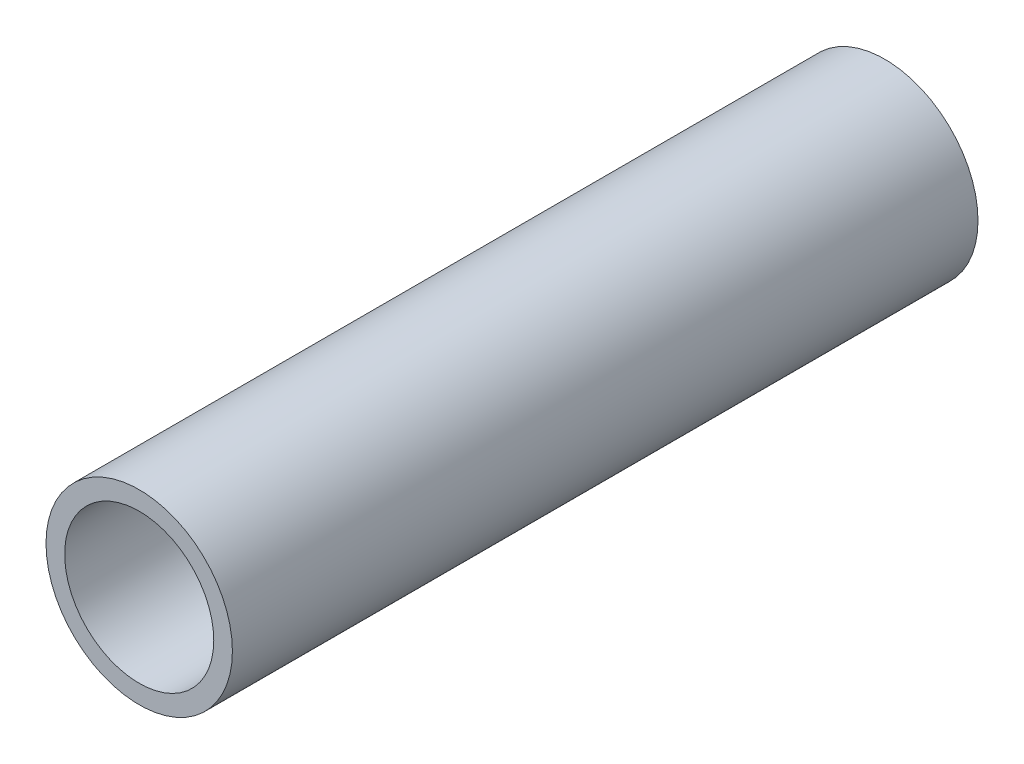
ISO-10303-21;
HEADER;
FILE_DESCRIPTION(('STEP AP214'),'2;1');
FILE_NAME('part.step','',(''),(''),'','','');
FILE_SCHEMA(('AUTOMOTIVE_DESIGN { 1 0 10303 214 1 1 1 1 }'));
ENDSEC;
DATA;
#1=APPLICATION_CONTEXT('core data for automotive mechanical design processes');
#2=APPLICATION_PROTOCOL_DEFINITION('international standard','automotive_design',2000,#1);
#3=PRODUCT_CONTEXT('',#1,'mechanical');
#4=PRODUCT('Part','Part','',(#3));
#5=PRODUCT_RELATED_PRODUCT_CATEGORY('part','',(#4));
#6=PRODUCT_DEFINITION_FORMATION('','',#4);
#7=PRODUCT_DEFINITION_CONTEXT('part definition',#1,'design');
#8=PRODUCT_DEFINITION('design','',#6,#7);
#9=PRODUCT_DEFINITION_SHAPE('','',#8);
#10=(LENGTH_UNIT() NAMED_UNIT(*) SI_UNIT(.MILLI.,.METRE.));
#11=(NAMED_UNIT(*) PLANE_ANGLE_UNIT() SI_UNIT($,.RADIAN.));
#12=(NAMED_UNIT(*) SI_UNIT($,.STERADIAN.) SOLID_ANGLE_UNIT());
#13=UNCERTAINTY_MEASURE_WITH_UNIT(LENGTH_MEASURE(1.E-05),#10,'distance_accuracy_value','');
#14=(GEOMETRIC_REPRESENTATION_CONTEXT(3) GLOBAL_UNCERTAINTY_ASSIGNED_CONTEXT((#13)) GLOBAL_UNIT_ASSIGNED_CONTEXT((#10,
#11,#12)) REPRESENTATION_CONTEXT('',''));
#15=CARTESIAN_POINT('',(0.,0.,0.));
#16=DIRECTION('',(0.,0.,1.));
#17=DIRECTION('',(1.,0.,0.));
#18=AXIS2_PLACEMENT_3D('',#15,#16,#17);
#19=CARTESIAN_POINT('',(0.,0.,100.));
#20=DIRECTION('',(0.,0.,1.));
#21=DIRECTION('',(1.,0.,0.));
#22=AXIS2_PLACEMENT_3D('',#19,#20,#21);
#23=PLANE('',#22);
#24=CARTESIAN_POINT('',(0.,0.,100.));
#25=DIRECTION('',(0.,0.,1.));
#26=DIRECTION('',(1.,0.,0.));
#27=AXIS2_PLACEMENT_3D('',#24,#25,#26);
#28=CIRCLE('',#27,12.5);
#29=CARTESIAN_POINT('',(12.5,0.,100.));
#30=VERTEX_POINT('',#29);
#31=EDGE_CURVE('E10',#30,#30,#28,.T.);
#32=ORIENTED_EDGE('',*,*,#31,.T.);
#33=EDGE_LOOP('',(#32));
#34=FACE_BOUND('',#33,.T.);
#35=CARTESIAN_POINT('',(0.,0.,100.));
#36=DIRECTION('',(0.,0.,1.));
#37=DIRECTION('',(1.,0.,0.));
#38=AXIS2_PLACEMENT_3D('',#35,#36,#37);
#39=CIRCLE('',#38,10.);
#40=CARTESIAN_POINT('',(10.,0.,100.));
#41=VERTEX_POINT('',#40);
#42=EDGE_CURVE('E52',#41,#41,#39,.T.);
#43=ORIENTED_EDGE('',*,*,#42,.F.);
#44=EDGE_LOOP('',(#43));
#45=FACE_BOUND('',#44,.T.);
#46=ADVANCED_FACE('F39',(#34,#45),#23,.T.);
#47=CARTESIAN_POINT('',(0.,0.,0.));
#48=DIRECTION('',(0.,0.,1.));
#49=DIRECTION('',(1.,0.,0.));
#50=AXIS2_PLACEMENT_3D('',#47,#48,#49);
#51=PLANE('',#50);
#52=CARTESIAN_POINT('',(0.,0.,0.));
#53=DIRECTION('',(0.,0.,1.));
#54=DIRECTION('',(1.,0.,0.));
#55=AXIS2_PLACEMENT_3D('',#52,#53,#54);
#56=CIRCLE('',#55,12.5);
#57=CARTESIAN_POINT('',(12.5,0.,0.));
#58=VERTEX_POINT('',#57);
#59=EDGE_CURVE('E43',#58,#58,#56,.T.);
#60=ORIENTED_EDGE('',*,*,#59,.F.);
#61=EDGE_LOOP('',(#60));
#62=FACE_BOUND('',#61,.T.);
#63=CARTESIAN_POINT('',(0.,0.,0.));
#64=DIRECTION('',(0.,0.,1.));
#65=DIRECTION('',(1.,0.,0.));
#66=AXIS2_PLACEMENT_3D('',#63,#64,#65);
#67=CIRCLE('',#66,10.);
#68=CARTESIAN_POINT('',(10.,0.,0.));
#69=VERTEX_POINT('',#68);
#70=EDGE_CURVE('E54',#69,#69,#67,.T.);
#71=ORIENTED_EDGE('',*,*,#70,.T.);
#72=EDGE_LOOP('',(#71));
#73=FACE_BOUND('',#72,.T.);
#74=ADVANCED_FACE('F66',(#62,#73),#51,.F.);
#75=CARTESIAN_POINT('',(0.,0.,100.));
#76=DIRECTION('',(0.,0.,-1.));
#77=DIRECTION('',(-1.,0.,0.));
#78=AXIS2_PLACEMENT_3D('',#75,#76,#77);
#79=CYLINDRICAL_SURFACE('',#78,12.5);
#80=ORIENTED_EDGE('',*,*,#31,.F.);
#81=EDGE_LOOP('',(#80));
#82=FACE_BOUND('',#81,.T.);
#83=ORIENTED_EDGE('',*,*,#59,.T.);
#84=EDGE_LOOP('',(#83));
#85=FACE_BOUND('',#84,.T.);
#86=ADVANCED_FACE('F41',(#82,#85),#79,.T.);
#87=CARTESIAN_POINT('',(0.,0.,100.));
#88=DIRECTION('',(0.,0.,-1.));
#89=DIRECTION('',(-1.,0.,0.));
#90=AXIS2_PLACEMENT_3D('',#87,#88,#89);
#91=CYLINDRICAL_SURFACE('',#90,10.);
#92=ORIENTED_EDGE('',*,*,#42,.T.);
#93=EDGE_LOOP('',(#92));
#94=FACE_BOUND('',#93,.T.);
#95=ORIENTED_EDGE('',*,*,#70,.F.);
#96=EDGE_LOOP('',(#95));
#97=FACE_BOUND('',#96,.T.);
#98=ADVANCED_FACE('F62',(#94,#97),#91,.F.);
#99=CLOSED_SHELL('',(#46,#74,#86,#98));
#100=MANIFOLD_SOLID_BREP('B2',#99);
#101=ADVANCED_BREP_SHAPE_REPRESENTATION('',(#18,#100),#14);
#102=SHAPE_DEFINITION_REPRESENTATION(#9,#101);
ENDSEC;
END-ISO-10303-21;
